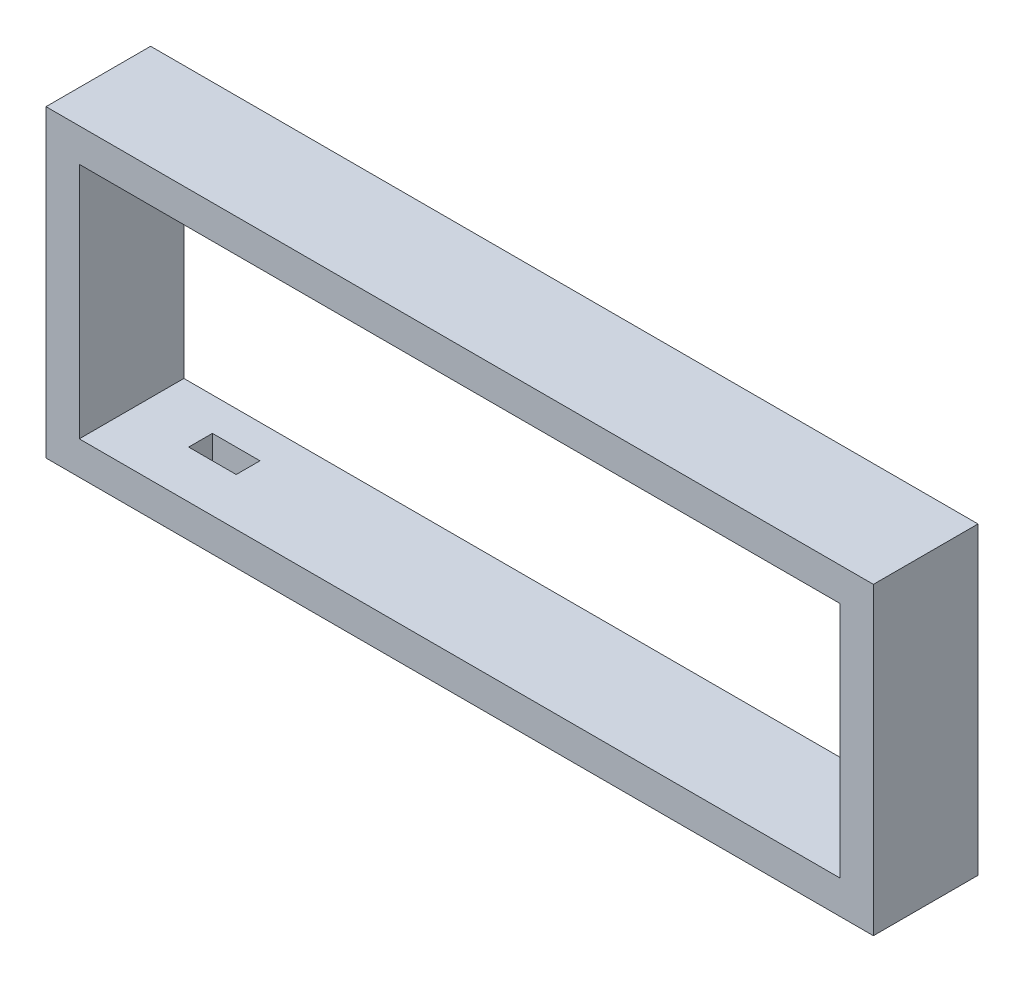
ISO-10303-21;
HEADER;
FILE_DESCRIPTION(('STEP AP214'),'2;1');
FILE_NAME('part.step','',(''),(''),'','','');
FILE_SCHEMA(('AUTOMOTIVE_DESIGN { 1 0 10303 214 1 1 1 1 }'));
ENDSEC;
DATA;
#1=APPLICATION_CONTEXT('core data for automotive mechanical design processes');
#2=APPLICATION_PROTOCOL_DEFINITION('international standard','automotive_design',2000,#1);
#3=PRODUCT_CONTEXT('',#1,'mechanical');
#4=PRODUCT('Part','Part','',(#3));
#5=PRODUCT_RELATED_PRODUCT_CATEGORY('part','',(#4));
#6=PRODUCT_DEFINITION_FORMATION('','',#4);
#7=PRODUCT_DEFINITION_CONTEXT('part definition',#1,'design');
#8=PRODUCT_DEFINITION('design','',#6,#7);
#9=PRODUCT_DEFINITION_SHAPE('','',#8);
#10=(LENGTH_UNIT() NAMED_UNIT(*) SI_UNIT(.MILLI.,.METRE.));
#11=(NAMED_UNIT(*) PLANE_ANGLE_UNIT() SI_UNIT($,.RADIAN.));
#12=(NAMED_UNIT(*) SI_UNIT($,.STERADIAN.) SOLID_ANGLE_UNIT());
#13=UNCERTAINTY_MEASURE_WITH_UNIT(LENGTH_MEASURE(1.E-05),#10,'distance_accuracy_value','');
#14=(GEOMETRIC_REPRESENTATION_CONTEXT(3) GLOBAL_UNCERTAINTY_ASSIGNED_CONTEXT((#13)) GLOBAL_UNIT_ASSIGNED_CONTEXT((#10,
#11,#12)) REPRESENTATION_CONTEXT('',''));
#15=CARTESIAN_POINT('',(0.,0.,0.));
#16=DIRECTION('',(0.,0.,1.));
#17=DIRECTION('',(1.,0.,0.));
#18=AXIS2_PLACEMENT_3D('',#15,#16,#17);
#19=CARTESIAN_POINT('',(0.,0.,0.));
#20=DIRECTION('',(0.,0.,1.));
#21=DIRECTION('',(1.,0.,0.));
#22=AXIS2_PLACEMENT_3D('',#19,#20,#21);
#23=PLANE('',#22);
#24=DIRECTION('',(1.,0.,0.));
#25=VECTOR('',#24,1.);
#26=CARTESIAN_POINT('',(-7.,-7.,0.));
#27=LINE('',#26,#25);
#28=CARTESIAN_POINT('',(-7.,-7.,0.));
#29=VERTEX_POINT('',#28);
#30=CARTESIAN_POINT('',(167.,-7.,0.));
#31=VERTEX_POINT('',#30);
#32=EDGE_CURVE('E207',#29,#31,#27,.T.);
#33=ORIENTED_EDGE('',*,*,#32,.F.);
#34=DIRECTION('',(0.,-1.,0.));
#35=VECTOR('',#34,1.);
#36=CARTESIAN_POINT('',(-7.,-7.,0.));
#37=LINE('',#36,#35);
#38=CARTESIAN_POINT('',(-7.,57.,0.));
#39=VERTEX_POINT('',#38);
#40=EDGE_CURVE('E214',#39,#29,#37,.T.);
#41=ORIENTED_EDGE('',*,*,#40,.F.);
#42=DIRECTION('',(-1.,0.,0.));
#43=VECTOR('',#42,1.);
#44=CARTESIAN_POINT('',(-7.,57.,0.));
#45=LINE('',#44,#43);
#46=CARTESIAN_POINT('',(167.,57.,0.));
#47=VERTEX_POINT('',#46);
#48=EDGE_CURVE('E212',#47,#39,#45,.T.);
#49=ORIENTED_EDGE('',*,*,#48,.F.);
#50=DIRECTION('',(0.,1.,0.));
#51=VECTOR('',#50,1.);
#52=CARTESIAN_POINT('',(167.,-7.,0.));
#53=LINE('',#52,#51);
#54=EDGE_CURVE('E210',#31,#47,#53,.T.);
#55=ORIENTED_EDGE('',*,*,#54,.F.);
#56=EDGE_LOOP('',(#33,#41,#49,#55));
#57=FACE_BOUND('',#56,.T.);
#58=DIRECTION('',(0.,-1.,0.));
#59=VECTOR('',#58,1.);
#60=CARTESIAN_POINT('',(0.,0.,0.));
#61=LINE('',#60,#59);
#62=CARTESIAN_POINT('',(0.,50.,0.));
#63=VERTEX_POINT('',#62);
#64=CARTESIAN_POINT('',(0.,0.,0.));
#65=VERTEX_POINT('',#64);
#66=EDGE_CURVE('E185',#63,#65,#61,.T.);
#67=ORIENTED_EDGE('',*,*,#66,.T.);
#68=DIRECTION('',(1.,0.,0.));
#69=VECTOR('',#68,1.);
#70=CARTESIAN_POINT('',(0.,0.,0.));
#71=LINE('',#70,#69);
#72=CARTESIAN_POINT('',(160.,0.,0.));
#73=VERTEX_POINT('',#72);
#74=EDGE_CURVE('E188',#65,#73,#71,.T.);
#75=ORIENTED_EDGE('',*,*,#74,.T.);
#76=DIRECTION('',(0.,1.,0.));
#77=VECTOR('',#76,1.);
#78=CARTESIAN_POINT('',(160.,0.,0.));
#79=LINE('',#78,#77);
#80=CARTESIAN_POINT('',(160.,50.,0.));
#81=VERTEX_POINT('',#80);
#82=EDGE_CURVE('E191',#73,#81,#79,.T.);
#83=ORIENTED_EDGE('',*,*,#82,.T.);
#84=DIRECTION('',(-1.,0.,0.));
#85=VECTOR('',#84,1.);
#86=CARTESIAN_POINT('',(0.,50.,0.));
#87=LINE('',#86,#85);
#88=EDGE_CURVE('E194',#81,#63,#87,.T.);
#89=ORIENTED_EDGE('',*,*,#88,.T.);
#90=EDGE_LOOP('',(#67,#75,#83,#89));
#91=FACE_BOUND('',#90,.T.);
#92=ADVANCED_FACE('F37',(#57,#91),#23,.F.);
#93=CARTESIAN_POINT('',(-7.,-7.,2.));
#94=DIRECTION('',(0.,1.,0.));
#95=DIRECTION('',(0.,0.,1.));
#96=AXIS2_PLACEMENT_3D('',#93,#94,#95);
#97=PLANE('',#96);
#98=DIRECTION('',(-1.,0.,0.));
#99=VECTOR('',#98,1.);
#100=CARTESIAN_POINT('',(13.,-7.,7.));
#101=LINE('',#100,#99);
#102=CARTESIAN_POINT('',(23.,-7.,7.));
#103=VERTEX_POINT('',#102);
#104=CARTESIAN_POINT('',(13.,-7.,7.));
#105=VERTEX_POINT('',#104);
#106=EDGE_CURVE('E134',#103,#105,#101,.T.);
#107=ORIENTED_EDGE('',*,*,#106,.T.);
#108=DIRECTION('',(0.,0.,1.));
#109=VECTOR('',#108,1.);
#110=CARTESIAN_POINT('',(13.,-7.,12.));
#111=LINE('',#110,#109);
#112=CARTESIAN_POINT('',(13.,-7.,12.));
#113=VERTEX_POINT('',#112);
#114=EDGE_CURVE('E128',#105,#113,#111,.T.);
#115=ORIENTED_EDGE('',*,*,#114,.T.);
#116=DIRECTION('',(1.,0.,0.));
#117=VECTOR('',#116,1.);
#118=CARTESIAN_POINT('',(13.,-7.,12.));
#119=LINE('',#118,#117);
#120=CARTESIAN_POINT('',(23.,-7.,12.));
#121=VERTEX_POINT('',#120);
#122=EDGE_CURVE('E137',#113,#121,#119,.T.);
#123=ORIENTED_EDGE('',*,*,#122,.T.);
#124=DIRECTION('',(0.,0.,-1.));
#125=VECTOR('',#124,1.);
#126=CARTESIAN_POINT('',(23.,-7.,12.));
#127=LINE('',#126,#125);
#128=EDGE_CURVE('E52',#121,#103,#127,.T.);
#129=ORIENTED_EDGE('',*,*,#128,.T.);
#130=EDGE_LOOP('',(#107,#115,#123,#129));
#131=FACE_BOUND('',#130,.T.);
#132=ORIENTED_EDGE('',*,*,#32,.T.);
#133=DIRECTION('',(0.,0.,-1.));
#134=VECTOR('',#133,1.);
#135=CARTESIAN_POINT('',(167.,-7.,2.));
#136=LINE('',#135,#134);
#137=CARTESIAN_POINT('',(167.,-7.,22.));
#138=VERTEX_POINT('',#137);
#139=EDGE_CURVE('E11',#138,#31,#136,.T.);
#140=ORIENTED_EDGE('',*,*,#139,.F.);
#141=DIRECTION('',(1.,0.,0.));
#142=VECTOR('',#141,1.);
#143=CARTESIAN_POINT('',(-7.,-7.,22.));
#144=LINE('',#143,#142);
#145=CARTESIAN_POINT('',(-7.,-7.,22.));
#146=VERTEX_POINT('',#145);
#147=EDGE_CURVE('E176',#146,#138,#144,.T.);
#148=ORIENTED_EDGE('',*,*,#147,.F.);
#149=DIRECTION('',(0.,0.,-1.));
#150=VECTOR('',#149,1.);
#151=CARTESIAN_POINT('',(-7.,-7.,2.));
#152=LINE('',#151,#150);
#153=EDGE_CURVE('E216',#146,#29,#152,.T.);
#154=ORIENTED_EDGE('',*,*,#153,.T.);
#155=EDGE_LOOP('',(#132,#140,#148,#154));
#156=FACE_BOUND('',#155,.T.);
#157=ADVANCED_FACE('F39',(#131,#156),#97,.F.);
#158=CARTESIAN_POINT('',(167.,-7.,2.));
#159=DIRECTION('',(-1.,0.,0.));
#160=DIRECTION('',(0.,0.,1.));
#161=AXIS2_PLACEMENT_3D('',#158,#159,#160);
#162=PLANE('',#161);
#163=ORIENTED_EDGE('',*,*,#54,.T.);
#164=DIRECTION('',(0.,0.,-1.));
#165=VECTOR('',#164,1.);
#166=CARTESIAN_POINT('',(167.,57.,2.));
#167=LINE('',#166,#165);
#168=CARTESIAN_POINT('',(167.,57.,22.));
#169=VERTEX_POINT('',#168);
#170=EDGE_CURVE('E45',#169,#47,#167,.T.);
#171=ORIENTED_EDGE('',*,*,#170,.F.);
#172=DIRECTION('',(0.,1.,0.));
#173=VECTOR('',#172,1.);
#174=CARTESIAN_POINT('',(167.,-7.,22.));
#175=LINE('',#174,#173);
#176=EDGE_CURVE('E179',#138,#169,#175,.T.);
#177=ORIENTED_EDGE('',*,*,#176,.F.);
#178=ORIENTED_EDGE('',*,*,#139,.T.);
#179=EDGE_LOOP('',(#163,#171,#177,#178));
#180=FACE_BOUND('',#179,.T.);
#181=ADVANCED_FACE('F239',(#180),#162,.F.);
#182=CARTESIAN_POINT('',(-7.,57.,2.));
#183=DIRECTION('',(0.,-1.,0.));
#184=DIRECTION('',(0.,0.,-1.));
#185=AXIS2_PLACEMENT_3D('',#182,#183,#184);
#186=PLANE('',#185);
#187=ORIENTED_EDGE('',*,*,#48,.T.);
#188=DIRECTION('',(0.,0.,-1.));
#189=VECTOR('',#188,1.);
#190=CARTESIAN_POINT('',(-7.,57.,2.));
#191=LINE('',#190,#189);
#192=CARTESIAN_POINT('',(-7.,57.,22.));
#193=VERTEX_POINT('',#192);
#194=EDGE_CURVE('E219',#193,#39,#191,.T.);
#195=ORIENTED_EDGE('',*,*,#194,.F.);
#196=DIRECTION('',(-1.,0.,0.));
#197=VECTOR('',#196,1.);
#198=CARTESIAN_POINT('',(-7.,57.,22.));
#199=LINE('',#198,#197);
#200=EDGE_CURVE('E182',#169,#193,#199,.T.);
#201=ORIENTED_EDGE('',*,*,#200,.F.);
#202=ORIENTED_EDGE('',*,*,#170,.T.);
#203=EDGE_LOOP('',(#187,#195,#201,#202));
#204=FACE_BOUND('',#203,.T.);
#205=ADVANCED_FACE('F225',(#204),#186,.F.);
#206=CARTESIAN_POINT('',(-7.,-7.,2.));
#207=DIRECTION('',(1.,0.,0.));
#208=DIRECTION('',(0.,0.,-1.));
#209=AXIS2_PLACEMENT_3D('',#206,#207,#208);
#210=PLANE('',#209);
#211=ORIENTED_EDGE('',*,*,#40,.T.);
#212=ORIENTED_EDGE('',*,*,#153,.F.);
#213=DIRECTION('',(0.,-1.,0.));
#214=VECTOR('',#213,1.);
#215=CARTESIAN_POINT('',(-7.,-7.,22.));
#216=LINE('',#215,#214);
#217=EDGE_CURVE('E173',#193,#146,#216,.T.);
#218=ORIENTED_EDGE('',*,*,#217,.F.);
#219=ORIENTED_EDGE('',*,*,#194,.T.);
#220=EDGE_LOOP('',(#211,#212,#218,#219));
#221=FACE_BOUND('',#220,.T.);
#222=ADVANCED_FACE('F233',(#221),#210,.F.);
#223=CARTESIAN_POINT('',(0.,0.,2.));
#224=DIRECTION('',(1.,0.,0.));
#225=DIRECTION('',(0.,0.,-1.));
#226=AXIS2_PLACEMENT_3D('',#223,#224,#225);
#227=PLANE('',#226);
#228=ORIENTED_EDGE('',*,*,#66,.F.);
#229=DIRECTION('',(0.,0.,-1.));
#230=VECTOR('',#229,1.);
#231=CARTESIAN_POINT('',(0.,50.,2.));
#232=LINE('',#231,#230);
#233=CARTESIAN_POINT('',(0.,50.,22.));
#234=VERTEX_POINT('',#233);
#235=EDGE_CURVE('E197',#234,#63,#232,.T.);
#236=ORIENTED_EDGE('',*,*,#235,.F.);
#237=DIRECTION('',(0.,-1.,0.));
#238=VECTOR('',#237,1.);
#239=CARTESIAN_POINT('',(0.,0.,22.));
#240=LINE('',#239,#238);
#241=CARTESIAN_POINT('',(0.,0.,22.));
#242=VERTEX_POINT('',#241);
#243=EDGE_CURVE('E158',#234,#242,#240,.T.);
#244=ORIENTED_EDGE('',*,*,#243,.T.);
#245=DIRECTION('',(0.,0.,-1.));
#246=VECTOR('',#245,1.);
#247=CARTESIAN_POINT('',(0.,0.,2.));
#248=LINE('',#247,#246);
#249=EDGE_CURVE('E204',#242,#65,#248,.T.);
#250=ORIENTED_EDGE('',*,*,#249,.T.);
#251=EDGE_LOOP('',(#228,#236,#244,#250));
#252=FACE_BOUND('',#251,.T.);
#253=ADVANCED_FACE('F252',(#252),#227,.T.);
#254=CARTESIAN_POINT('',(0.,0.,2.));
#255=DIRECTION('',(0.,1.,0.));
#256=DIRECTION('',(0.,0.,1.));
#257=AXIS2_PLACEMENT_3D('',#254,#255,#256);
#258=PLANE('',#257);
#259=DIRECTION('',(0.,0.,1.));
#260=VECTOR('',#259,1.);
#261=CARTESIAN_POINT('',(13.,0.,12.));
#262=LINE('',#261,#260);
#263=CARTESIAN_POINT('',(13.,0.,7.));
#264=VERTEX_POINT('',#263);
#265=CARTESIAN_POINT('',(13.,0.,12.));
#266=VERTEX_POINT('',#265);
#267=EDGE_CURVE('E60',#264,#266,#262,.T.);
#268=ORIENTED_EDGE('',*,*,#267,.F.);
#269=DIRECTION('',(-1.,0.,0.));
#270=VECTOR('',#269,1.);
#271=CARTESIAN_POINT('',(13.,0.,7.));
#272=LINE('',#271,#270);
#273=CARTESIAN_POINT('',(23.,0.,7.));
#274=VERTEX_POINT('',#273);
#275=EDGE_CURVE('E143',#274,#264,#272,.T.);
#276=ORIENTED_EDGE('',*,*,#275,.F.);
#277=DIRECTION('',(0.,0.,-1.));
#278=VECTOR('',#277,1.);
#279=CARTESIAN_POINT('',(23.,0.,12.));
#280=LINE('',#279,#278);
#281=CARTESIAN_POINT('',(23.,0.,12.));
#282=VERTEX_POINT('',#281);
#283=EDGE_CURVE('E146',#282,#274,#280,.T.);
#284=ORIENTED_EDGE('',*,*,#283,.F.);
#285=DIRECTION('',(1.,0.,0.));
#286=VECTOR('',#285,1.);
#287=CARTESIAN_POINT('',(13.,0.,12.));
#288=LINE('',#287,#286);
#289=EDGE_CURVE('E152',#266,#282,#288,.T.);
#290=ORIENTED_EDGE('',*,*,#289,.F.);
#291=EDGE_LOOP('',(#268,#276,#284,#290));
#292=FACE_BOUND('',#291,.T.);
#293=ORIENTED_EDGE('',*,*,#74,.F.);
#294=ORIENTED_EDGE('',*,*,#249,.F.);
#295=DIRECTION('',(1.,0.,0.));
#296=VECTOR('',#295,1.);
#297=CARTESIAN_POINT('',(0.,0.,22.));
#298=LINE('',#297,#296);
#299=CARTESIAN_POINT('',(160.,0.,22.));
#300=VERTEX_POINT('',#299);
#301=EDGE_CURVE('E164',#242,#300,#298,.T.);
#302=ORIENTED_EDGE('',*,*,#301,.T.);
#303=DIRECTION('',(0.,0.,-1.));
#304=VECTOR('',#303,1.);
#305=CARTESIAN_POINT('',(160.,0.,2.));
#306=LINE('',#305,#304);
#307=EDGE_CURVE('E202',#300,#73,#306,.T.);
#308=ORIENTED_EDGE('',*,*,#307,.T.);
#309=EDGE_LOOP('',(#293,#294,#302,#308));
#310=FACE_BOUND('',#309,.T.);
#311=ADVANCED_FACE('F258',(#292,#310),#258,.T.);
#312=CARTESIAN_POINT('',(160.,0.,2.));
#313=DIRECTION('',(-1.,0.,0.));
#314=DIRECTION('',(0.,0.,1.));
#315=AXIS2_PLACEMENT_3D('',#312,#313,#314);
#316=PLANE('',#315);
#317=ORIENTED_EDGE('',*,*,#82,.F.);
#318=ORIENTED_EDGE('',*,*,#307,.F.);
#319=DIRECTION('',(0.,1.,0.));
#320=VECTOR('',#319,1.);
#321=CARTESIAN_POINT('',(160.,0.,22.));
#322=LINE('',#321,#320);
#323=CARTESIAN_POINT('',(160.,50.,22.));
#324=VERTEX_POINT('',#323);
#325=EDGE_CURVE('E167',#300,#324,#322,.T.);
#326=ORIENTED_EDGE('',*,*,#325,.T.);
#327=DIRECTION('',(0.,0.,-1.));
#328=VECTOR('',#327,1.);
#329=CARTESIAN_POINT('',(160.,50.,2.));
#330=LINE('',#329,#328);
#331=EDGE_CURVE('E200',#324,#81,#330,.T.);
#332=ORIENTED_EDGE('',*,*,#331,.T.);
#333=EDGE_LOOP('',(#317,#318,#326,#332));
#334=FACE_BOUND('',#333,.T.);
#335=ADVANCED_FACE('F263',(#334),#316,.T.);
#336=CARTESIAN_POINT('',(0.,50.,2.));
#337=DIRECTION('',(0.,-1.,0.));
#338=DIRECTION('',(0.,0.,-1.));
#339=AXIS2_PLACEMENT_3D('',#336,#337,#338);
#340=PLANE('',#339);
#341=ORIENTED_EDGE('',*,*,#88,.F.);
#342=ORIENTED_EDGE('',*,*,#331,.F.);
#343=DIRECTION('',(-1.,0.,0.));
#344=VECTOR('',#343,1.);
#345=CARTESIAN_POINT('',(0.,50.,22.));
#346=LINE('',#345,#344);
#347=EDGE_CURVE('E170',#324,#234,#346,.T.);
#348=ORIENTED_EDGE('',*,*,#347,.T.);
#349=ORIENTED_EDGE('',*,*,#235,.T.);
#350=EDGE_LOOP('',(#341,#342,#348,#349));
#351=FACE_BOUND('',#350,.T.);
#352=ADVANCED_FACE('F267',(#351),#340,.T.);
#353=CARTESIAN_POINT('',(0.,0.,22.));
#354=DIRECTION('',(0.,0.,-1.));
#355=DIRECTION('',(-1.,0.,0.));
#356=AXIS2_PLACEMENT_3D('',#353,#354,#355);
#357=PLANE('',#356);
#358=ORIENTED_EDGE('',*,*,#217,.T.);
#359=ORIENTED_EDGE('',*,*,#147,.T.);
#360=ORIENTED_EDGE('',*,*,#176,.T.);
#361=ORIENTED_EDGE('',*,*,#200,.T.);
#362=EDGE_LOOP('',(#358,#359,#360,#361));
#363=FACE_BOUND('',#362,.T.);
#364=ORIENTED_EDGE('',*,*,#243,.F.);
#365=ORIENTED_EDGE('',*,*,#347,.F.);
#366=ORIENTED_EDGE('',*,*,#325,.F.);
#367=ORIENTED_EDGE('',*,*,#301,.F.);
#368=EDGE_LOOP('',(#364,#365,#366,#367));
#369=FACE_BOUND('',#368,.T.);
#370=ADVANCED_FACE('F237',(#363,#369),#357,.F.);
#371=CARTESIAN_POINT('',(13.,-7.,12.));
#372=DIRECTION('',(-1.,0.,0.));
#373=DIRECTION('',(0.,0.,1.));
#374=AXIS2_PLACEMENT_3D('',#371,#372,#373);
#375=PLANE('',#374);
#376=ORIENTED_EDGE('',*,*,#267,.T.);
#377=DIRECTION('',(0.,1.,0.));
#378=VECTOR('',#377,1.);
#379=CARTESIAN_POINT('',(13.,-7.,12.));
#380=LINE('',#379,#378);
#381=EDGE_CURVE('E124',#113,#266,#380,.T.);
#382=ORIENTED_EDGE('',*,*,#381,.F.);
#383=ORIENTED_EDGE('',*,*,#114,.F.);
#384=DIRECTION('',(0.,1.,0.));
#385=VECTOR('',#384,1.);
#386=CARTESIAN_POINT('',(13.,-7.,7.));
#387=LINE('',#386,#385);
#388=EDGE_CURVE('E156',#105,#264,#387,.T.);
#389=ORIENTED_EDGE('',*,*,#388,.T.);
#390=EDGE_LOOP('',(#376,#382,#383,#389));
#391=FACE_BOUND('',#390,.T.);
#392=ADVANCED_FACE('F126',(#391),#375,.F.);
#393=CARTESIAN_POINT('',(13.,-7.,7.));
#394=DIRECTION('',(0.,0.,-1.));
#395=DIRECTION('',(-1.,0.,0.));
#396=AXIS2_PLACEMENT_3D('',#393,#394,#395);
#397=PLANE('',#396);
#398=ORIENTED_EDGE('',*,*,#275,.T.);
#399=ORIENTED_EDGE('',*,*,#388,.F.);
#400=ORIENTED_EDGE('',*,*,#106,.F.);
#401=DIRECTION('',(0.,1.,0.));
#402=VECTOR('',#401,1.);
#403=CARTESIAN_POINT('',(23.,-7.,7.));
#404=LINE('',#403,#402);
#405=EDGE_CURVE('E159',#103,#274,#404,.T.);
#406=ORIENTED_EDGE('',*,*,#405,.T.);
#407=EDGE_LOOP('',(#398,#399,#400,#406));
#408=FACE_BOUND('',#407,.T.);
#409=ADVANCED_FACE('F281',(#408),#397,.F.);
#410=CARTESIAN_POINT('',(23.,-7.,12.));
#411=DIRECTION('',(1.,0.,0.));
#412=DIRECTION('',(0.,0.,-1.));
#413=AXIS2_PLACEMENT_3D('',#410,#411,#412);
#414=PLANE('',#413);
#415=ORIENTED_EDGE('',*,*,#283,.T.);
#416=ORIENTED_EDGE('',*,*,#405,.F.);
#417=ORIENTED_EDGE('',*,*,#128,.F.);
#418=DIRECTION('',(0.,1.,0.));
#419=VECTOR('',#418,1.);
#420=CARTESIAN_POINT('',(23.,-7.,12.));
#421=LINE('',#420,#419);
#422=EDGE_CURVE('E133',#121,#282,#421,.T.);
#423=ORIENTED_EDGE('',*,*,#422,.T.);
#424=EDGE_LOOP('',(#415,#416,#417,#423));
#425=FACE_BOUND('',#424,.T.);
#426=ADVANCED_FACE('F329',(#425),#414,.F.);
#427=CARTESIAN_POINT('',(13.,-7.,12.));
#428=DIRECTION('',(0.,0.,1.));
#429=DIRECTION('',(1.,0.,0.));
#430=AXIS2_PLACEMENT_3D('',#427,#428,#429);
#431=PLANE('',#430);
#432=ORIENTED_EDGE('',*,*,#289,.T.);
#433=ORIENTED_EDGE('',*,*,#422,.F.);
#434=ORIENTED_EDGE('',*,*,#122,.F.);
#435=ORIENTED_EDGE('',*,*,#381,.T.);
#436=EDGE_LOOP('',(#432,#433,#434,#435));
#437=FACE_BOUND('',#436,.T.);
#438=ADVANCED_FACE('F138',(#437),#431,.F.);
#439=CLOSED_SHELL('',(#92,#157,#181,#205,#222,#253,#311,#335,#352,#370,#392,#409,#426,#438));
#440=MANIFOLD_SOLID_BREP('B2',#439);
#441=ADVANCED_BREP_SHAPE_REPRESENTATION('',(#18,#440),#14);
#442=SHAPE_DEFINITION_REPRESENTATION(#9,#441);
ENDSEC;
END-ISO-10303-21;
